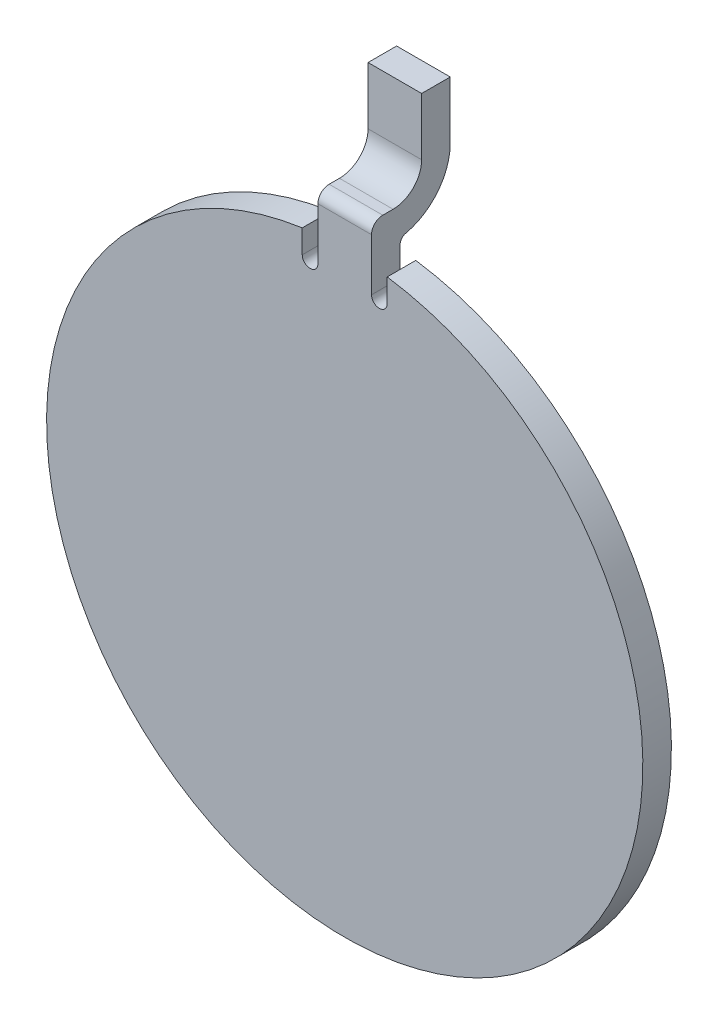
ISO-10303-21;
HEADER;
FILE_DESCRIPTION(('STEP AP214'),'2;1');
FILE_NAME('part.step','',(''),(''),'','','');
FILE_SCHEMA(('AUTOMOTIVE_DESIGN { 1 0 10303 214 1 1 1 1 }'));
ENDSEC;
DATA;
#1=APPLICATION_CONTEXT('core data for automotive mechanical design processes');
#2=APPLICATION_PROTOCOL_DEFINITION('international standard','automotive_design',2000,#1);
#3=PRODUCT_CONTEXT('',#1,'mechanical');
#4=PRODUCT('Part','Part','',(#3));
#5=PRODUCT_RELATED_PRODUCT_CATEGORY('part','',(#4));
#6=PRODUCT_DEFINITION_FORMATION('','',#4);
#7=PRODUCT_DEFINITION_CONTEXT('part definition',#1,'design');
#8=PRODUCT_DEFINITION('design','',#6,#7);
#9=PRODUCT_DEFINITION_SHAPE('','',#8);
#10=(LENGTH_UNIT() NAMED_UNIT(*) SI_UNIT(.MILLI.,.METRE.));
#11=(NAMED_UNIT(*) PLANE_ANGLE_UNIT() SI_UNIT($,.RADIAN.));
#12=(NAMED_UNIT(*) SI_UNIT($,.STERADIAN.) SOLID_ANGLE_UNIT());
#13=UNCERTAINTY_MEASURE_WITH_UNIT(LENGTH_MEASURE(1.E-05),#10,'distance_accuracy_value','');
#14=(GEOMETRIC_REPRESENTATION_CONTEXT(3) GLOBAL_UNCERTAINTY_ASSIGNED_CONTEXT((#13)) GLOBAL_UNIT_ASSIGNED_CONTEXT((#10,
#11,#12)) REPRESENTATION_CONTEXT('',''));
#15=CARTESIAN_POINT('',(0.,0.,0.));
#16=DIRECTION('',(0.,0.,1.));
#17=DIRECTION('',(1.,0.,0.));
#18=AXIS2_PLACEMENT_3D('',#15,#16,#17);
#19=CARTESIAN_POINT('',(-0.476507589397102,37.7055196206584,10.668));
#20=DIRECTION('',(0.,-1.,0.));
#21=DIRECTION('',(0.,0.,-1.));
#22=AXIS2_PLACEMENT_3D('',#19,#20,#21);
#23=PLANE('',#22);
#24=DIRECTION('',(0.,0.,1.));
#25=VECTOR('',#24,1.);
#26=CARTESIAN_POINT('',(-0.476507589397102,37.7055196206584,10.668));
#27=LINE('',#26,#25);
#28=CARTESIAN_POINT('',(-0.476507589397102,37.7055196206584,10.7928766138095));
#29=VERTEX_POINT('',#28);
#30=CARTESIAN_POINT('',(-0.476507589397102,37.7055196206584,10.976));
#31=VERTEX_POINT('',#30);
#32=EDGE_CURVE('E241',#29,#31,#27,.T.);
#33=ORIENTED_EDGE('',*,*,#32,.T.);
#34=DIRECTION('',(1.,0.,0.));
#35=VECTOR('',#34,1.);
#36=CARTESIAN_POINT('',(-0.476507589397102,37.7055196206584,10.976));
#37=LINE('',#36,#35);
#38=CARTESIAN_POINT('',(0.476507589397102,37.7055196206584,10.976));
#39=VERTEX_POINT('',#38);
#40=EDGE_CURVE('E254',#31,#39,#37,.T.);
#41=ORIENTED_EDGE('',*,*,#40,.T.);
#42=DIRECTION('',(0.,0.,1.));
#43=VECTOR('',#42,1.);
#44=CARTESIAN_POINT('',(0.476507589397102,37.7055196206584,10.668));
#45=LINE('',#44,#43);
#46=CARTESIAN_POINT('',(0.476507589397102,37.7055196206584,10.7928766138095));
#47=VERTEX_POINT('',#46);
#48=EDGE_CURVE('E236',#47,#39,#45,.T.);
#49=ORIENTED_EDGE('',*,*,#48,.F.);
#50=DIRECTION('',(-1.,0.,0.));
#51=VECTOR('',#50,1.);
#52=CARTESIAN_POINT('',(0.476507589397102,37.7055196206584,10.7928766138095));
#53=LINE('',#52,#51);
#54=EDGE_CURVE('E222',#47,#29,#53,.T.);
#55=ORIENTED_EDGE('',*,*,#54,.T.);
#56=EDGE_LOOP('',(#33,#41,#49,#55));
#57=FACE_BOUND('',#56,.T.);
#58=ADVANCED_FACE('F39',(#57),#23,.F.);
#59=CARTESIAN_POINT('',(0.,31.75,10.668));
#60=DIRECTION('',(0.,0.,-1.));
#61=DIRECTION('',(-1.,0.,0.));
#62=AXIS2_PLACEMENT_3D('',#59,#60,#61);
#63=PLANE('',#62);
#64=DIRECTION('',(0.,-1.,0.));
#65=VECTOR('',#64,1.);
#66=CARTESIAN_POINT('',(0.476507589397102,37.0276368196465,10.668));
#67=LINE('',#66,#65);
#68=CARTESIAN_POINT('',(0.476507589397102,37.0986173059169,10.668));
#69=VERTEX_POINT('',#68);
#70=CARTESIAN_POINT('',(0.476507589397102,36.5801523813832,10.668));
#71=VERTEX_POINT('',#70);
#72=EDGE_CURVE('E231',#69,#71,#67,.T.);
#73=ORIENTED_EDGE('',*,*,#72,.T.);
#74=CARTESIAN_POINT('',(0.615801998549159,36.5801523813832,10.668));
#75=DIRECTION('',(0.,0.,-1.));
#76=DIRECTION('',(1.,0.,0.));
#77=AXIS2_PLACEMENT_3D('',#74,#75,#76);
#78=CIRCLE('',#77,0.139294409152057);
#79=CARTESIAN_POINT('',(0.755096407701217,36.5801523813832,10.668));
#80=VERTEX_POINT('',#79);
#81=EDGE_CURVE('E162',#80,#71,#78,.T.);
#82=ORIENTED_EDGE('',*,*,#81,.F.);
#83=DIRECTION('',(0.,-1.,0.));
#84=VECTOR('',#83,1.);
#85=CARTESIAN_POINT('',(0.755096407701217,37.0838705948078,10.668));
#86=LINE('',#85,#84);
#87=CARTESIAN_POINT('',(0.755096407701217,36.9950299615844,10.668));
#88=VERTEX_POINT('',#87);
#89=EDGE_CURVE('E170',#88,#80,#86,.T.);
#90=ORIENTED_EDGE('',*,*,#89,.F.);
#91=CARTESIAN_POINT('',(0.,31.75,10.668));
#92=DIRECTION('',(0.,0.,-1.));
#93=DIRECTION('',(-1.,0.,0.));
#94=AXIS2_PLACEMENT_3D('',#91,#92,#93);
#95=CIRCLE('',#94,5.29910463029755);
#96=CARTESIAN_POINT('',(-0.755096407701217,36.9950299615844,10.668));
#97=VERTEX_POINT('',#96);
#98=EDGE_CURVE('E233',#88,#97,#95,.T.);
#99=ORIENTED_EDGE('',*,*,#98,.T.);
#100=DIRECTION('',(0.,1.,0.));
#101=VECTOR('',#100,1.);
#102=CARTESIAN_POINT('',(-0.755096407701217,37.0838705948078,10.668));
#103=LINE('',#102,#101);
#104=CARTESIAN_POINT('',(-0.755096407701217,36.5801523813832,10.668));
#105=VERTEX_POINT('',#104);
#106=EDGE_CURVE('E180',#105,#97,#103,.T.);
#107=ORIENTED_EDGE('',*,*,#106,.F.);
#108=CARTESIAN_POINT('',(-0.615801998549159,36.5801523813832,10.668));
#109=DIRECTION('',(0.,0.,-1.));
#110=DIRECTION('',(-1.,0.,0.));
#111=AXIS2_PLACEMENT_3D('',#108,#109,#110);
#112=CIRCLE('',#111,0.139294409152057);
#113=CARTESIAN_POINT('',(-0.476507589397102,36.5801523813832,10.668));
#114=VERTEX_POINT('',#113);
#115=EDGE_CURVE('E176',#114,#105,#112,.T.);
#116=ORIENTED_EDGE('',*,*,#115,.F.);
#117=DIRECTION('',(0.,1.,0.));
#118=VECTOR('',#117,1.);
#119=CARTESIAN_POINT('',(-0.476507589397102,37.0276368196465,10.668));
#120=LINE('',#119,#118);
#121=CARTESIAN_POINT('',(-0.476507589397102,37.0986173059169,10.668));
#122=VERTEX_POINT('',#121);
#123=EDGE_CURVE('E235',#114,#122,#120,.T.);
#124=ORIENTED_EDGE('',*,*,#123,.T.);
#125=DIRECTION('',(-1.,0.,0.));
#126=VECTOR('',#125,1.);
#127=CARTESIAN_POINT('',(0.,37.0986173059169,10.668));
#128=LINE('',#127,#126);
#129=EDGE_CURVE('E244',#122,#69,#128,.F.);
#130=ORIENTED_EDGE('',*,*,#129,.T.);
#131=EDGE_LOOP('',(#73,#82,#90,#99,#107,#116,#124,#130));
#132=FACE_BOUND('',#131,.T.);
#133=ADVANCED_FACE('F282',(#132),#63,.T.);
#134=CARTESIAN_POINT('',(0.476507589397102,37.0276368196465,10.668));
#135=DIRECTION('',(-1.,0.,0.));
#136=DIRECTION('',(0.,0.,1.));
#137=AXIS2_PLACEMENT_3D('',#134,#135,#136);
#138=PLANE('',#137);
#139=DIRECTION('',(0.,-1.,0.));
#140=VECTOR('',#139,1.);
#141=CARTESIAN_POINT('',(0.476507589397102,37.0276368196465,11.176));
#142=LINE('',#141,#140);
#143=CARTESIAN_POINT('',(0.476507589397102,37.5055196206584,11.176));
#144=VERTEX_POINT('',#143);
#145=CARTESIAN_POINT('',(0.476507589397102,36.5801523813832,11.176));
#146=VERTEX_POINT('',#145);
#147=EDGE_CURVE('E149',#144,#146,#142,.T.);
#148=ORIENTED_EDGE('',*,*,#147,.T.);
#149=DIRECTION('',(0.,0.,-1.));
#150=VECTOR('',#149,1.);
#151=CARTESIAN_POINT('',(0.476507589397102,36.5801523813832,11.176));
#152=LINE('',#151,#150);
#153=EDGE_CURVE('E152',#146,#71,#152,.T.);
#154=ORIENTED_EDGE('',*,*,#153,.T.);
#155=ORIENTED_EDGE('',*,*,#72,.F.);
#156=CARTESIAN_POINT('',(0.476507589397102,37.0986173059169,10.541));
#157=DIRECTION('',(-1.,0.,0.));
#158=DIRECTION('',(0.,0.,1.));
#159=AXIS2_PLACEMENT_3D('',#156,#157,#158);
#160=CIRCLE('',#159,0.127);
#161=CARTESIAN_POINT('',(0.476507589397102,37.2224953408882,10.5689862904233));
#162=VERTEX_POINT('',#161);
#163=EDGE_CURVE('E249',#69,#162,#160,.T.);
#164=ORIENTED_EDGE('',*,*,#163,.T.);
#165=CARTESIAN_POINT('',(0.476507589397102,38.2135196206584,10.7928766138095));
#166=DIRECTION('',(-1.,0.,0.));
#167=DIRECTION('',(0.,0.,1.));
#168=AXIS2_PLACEMENT_3D('',#165,#166,#167);
#169=CIRCLE('',#168,1.016);
#170=CARTESIAN_POINT('',(0.476507589397102,38.2135196206584,9.7768766138095));
#171=VERTEX_POINT('',#170);
#172=EDGE_CURVE('E204',#162,#171,#169,.F.);
#173=ORIENTED_EDGE('',*,*,#172,.T.);
#174=DIRECTION('',(0.,1.,0.));
#175=VECTOR('',#174,1.);
#176=CARTESIAN_POINT('',(0.476507589397102,38.2135196206584,9.7768766138095));
#177=LINE('',#176,#175);
#178=CARTESIAN_POINT('',(0.476507589397102,39.2339446156029,9.7768766138095));
#179=VERTEX_POINT('',#178);
#180=EDGE_CURVE('E202',#171,#179,#177,.T.);
#181=ORIENTED_EDGE('',*,*,#180,.T.);
#182=DIRECTION('',(0.,0.,1.));
#183=VECTOR('',#182,1.);
#184=CARTESIAN_POINT('',(0.476507589397102,39.2339446156029,9.7768766138095));
#185=LINE('',#184,#183);
#186=CARTESIAN_POINT('',(0.476507589397102,39.2339446156029,10.2848766138095));
#187=VERTEX_POINT('',#186);
#188=EDGE_CURVE('E199',#179,#187,#185,.T.);
#189=ORIENTED_EDGE('',*,*,#188,.T.);
#190=DIRECTION('',(0.,1.,0.));
#191=VECTOR('',#190,1.);
#192=CARTESIAN_POINT('',(0.476507589397102,38.2135196206584,10.2848766138095));
#193=LINE('',#192,#191);
#194=CARTESIAN_POINT('',(0.476507589397102,38.2135196206584,10.2848766138095));
#195=VERTEX_POINT('',#194);
#196=EDGE_CURVE('E196',#195,#187,#193,.T.);
#197=ORIENTED_EDGE('',*,*,#196,.F.);
#198=CARTESIAN_POINT('',(0.476507589397102,38.2135196206584,10.7928766138095));
#199=DIRECTION('',(1.,0.,0.));
#200=DIRECTION('',(0.,0.,-1.));
#201=AXIS2_PLACEMENT_3D('',#198,#199,#200);
#202=CIRCLE('',#201,0.508000000000001);
#203=EDGE_CURVE('E206',#47,#195,#202,.T.);
#204=ORIENTED_EDGE('',*,*,#203,.F.);
#205=ORIENTED_EDGE('',*,*,#48,.T.);
#206=CARTESIAN_POINT('',(0.476507589397102,37.5055196206584,10.976));
#207=DIRECTION('',(-1.,0.,0.));
#208=DIRECTION('',(0.,0.,1.));
#209=AXIS2_PLACEMENT_3D('',#206,#207,#208);
#210=CIRCLE('',#209,0.2);
#211=EDGE_CURVE('E155',#39,#144,#210,.F.);
#212=ORIENTED_EDGE('',*,*,#211,.T.);
#213=EDGE_LOOP('',(#148,#154,#155,#164,#173,#181,#189,#197,#204,#205,#212));
#214=FACE_BOUND('',#213,.T.);
#215=ADVANCED_FACE('F150',(#214),#138,.F.);
#216=CARTESIAN_POINT('',(0.,31.75,10.668));
#217=DIRECTION('',(0.,0.,1.));
#218=DIRECTION('',(1.,0.,0.));
#219=AXIS2_PLACEMENT_3D('',#216,#217,#218);
#220=CYLINDRICAL_SURFACE('',#219,5.29910463029755);
#221=ORIENTED_EDGE('',*,*,#98,.F.);
#222=DIRECTION('',(0.,0.,1.));
#223=VECTOR('',#222,1.);
#224=CARTESIAN_POINT('',(0.755096407701217,36.9950299615844,10.668));
#225=LINE('',#224,#223);
#226=CARTESIAN_POINT('',(0.755096407701217,36.9950299615844,11.176));
#227=VERTEX_POINT('',#226);
#228=EDGE_CURVE('E163',#88,#227,#225,.T.);
#229=ORIENTED_EDGE('',*,*,#228,.T.);
#230=CARTESIAN_POINT('',(0.,31.75,11.176));
#231=DIRECTION('',(0.,0.,-1.));
#232=DIRECTION('',(-1.,0.,0.));
#233=AXIS2_PLACEMENT_3D('',#230,#231,#232);
#234=CIRCLE('',#233,5.29910463029755);
#235=CARTESIAN_POINT('',(-0.755096407701217,36.9950299615844,11.176));
#236=VERTEX_POINT('',#235);
#237=EDGE_CURVE('E157',#227,#236,#234,.T.);
#238=ORIENTED_EDGE('',*,*,#237,.T.);
#239=DIRECTION('',(0.,0.,1.));
#240=VECTOR('',#239,1.);
#241=CARTESIAN_POINT('',(-0.755096407701217,36.9950299615844,10.668));
#242=LINE('',#241,#240);
#243=EDGE_CURVE('E190',#236,#97,#242,.F.);
#244=ORIENTED_EDGE('',*,*,#243,.T.);
#245=EDGE_LOOP('',(#221,#229,#238,#244));
#246=FACE_BOUND('',#245,.T.);
#247=ADVANCED_FACE('F293',(#246),#220,.T.);
#248=CARTESIAN_POINT('',(-0.476507589397102,37.0276368196465,10.668));
#249=DIRECTION('',(1.,0.,0.));
#250=DIRECTION('',(0.,0.,-1.));
#251=AXIS2_PLACEMENT_3D('',#248,#249,#250);
#252=PLANE('',#251);
#253=DIRECTION('',(0.,1.,0.));
#254=VECTOR('',#253,1.);
#255=CARTESIAN_POINT('',(-0.476507589397102,37.0276368196465,11.176));
#256=LINE('',#255,#254);
#257=CARTESIAN_POINT('',(-0.476507589397102,36.5801523813832,11.176));
#258=VERTEX_POINT('',#257);
#259=CARTESIAN_POINT('',(-0.476507589397102,37.5055196206584,11.176));
#260=VERTEX_POINT('',#259);
#261=EDGE_CURVE('E62',#258,#260,#256,.T.);
#262=ORIENTED_EDGE('',*,*,#261,.T.);
#263=CARTESIAN_POINT('',(-0.476507589397102,37.5055196206584,10.976));
#264=DIRECTION('',(1.,0.,0.));
#265=DIRECTION('',(0.,0.,-1.));
#266=AXIS2_PLACEMENT_3D('',#263,#264,#265);
#267=CIRCLE('',#266,0.2);
#268=EDGE_CURVE('E47',#260,#31,#267,.F.);
#269=ORIENTED_EDGE('',*,*,#268,.T.);
#270=ORIENTED_EDGE('',*,*,#32,.F.);
#271=CARTESIAN_POINT('',(-0.476507589397102,38.2135196206584,10.7928766138095));
#272=DIRECTION('',(1.,0.,0.));
#273=DIRECTION('',(0.,0.,-1.));
#274=AXIS2_PLACEMENT_3D('',#271,#272,#273);
#275=CIRCLE('',#274,0.508000000000001);
#276=CARTESIAN_POINT('',(-0.476507589397102,38.2135196206584,10.2848766138095));
#277=VERTEX_POINT('',#276);
#278=EDGE_CURVE('E200',#29,#277,#275,.T.);
#279=ORIENTED_EDGE('',*,*,#278,.T.);
#280=DIRECTION('',(0.,1.,0.));
#281=VECTOR('',#280,1.);
#282=CARTESIAN_POINT('',(-0.476507589397102,38.2135196206584,10.2848766138095));
#283=LINE('',#282,#281);
#284=CARTESIAN_POINT('',(-0.476507589397102,39.2339446156029,10.2848766138095));
#285=VERTEX_POINT('',#284);
#286=EDGE_CURVE('E195',#277,#285,#283,.T.);
#287=ORIENTED_EDGE('',*,*,#286,.T.);
#288=DIRECTION('',(0.,0.,1.));
#289=VECTOR('',#288,1.);
#290=CARTESIAN_POINT('',(-0.476507589397102,39.2339446156029,9.7768766138095));
#291=LINE('',#290,#289);
#292=CARTESIAN_POINT('',(-0.476507589397102,39.2339446156029,9.7768766138095));
#293=VERTEX_POINT('',#292);
#294=EDGE_CURVE('E212',#293,#285,#291,.T.);
#295=ORIENTED_EDGE('',*,*,#294,.F.);
#296=DIRECTION('',(0.,1.,0.));
#297=VECTOR('',#296,1.);
#298=CARTESIAN_POINT('',(-0.476507589397102,38.2135196206584,9.7768766138095));
#299=LINE('',#298,#297);
#300=CARTESIAN_POINT('',(-0.476507589397102,38.2135196206584,9.7768766138095));
#301=VERTEX_POINT('',#300);
#302=EDGE_CURVE('E215',#301,#293,#299,.T.);
#303=ORIENTED_EDGE('',*,*,#302,.F.);
#304=CARTESIAN_POINT('',(-0.476507589397102,38.2135196206584,10.7928766138095));
#305=DIRECTION('',(-1.,0.,0.));
#306=DIRECTION('',(0.,0.,1.));
#307=AXIS2_PLACEMENT_3D('',#304,#305,#306);
#308=CIRCLE('',#307,1.016);
#309=CARTESIAN_POINT('',(-0.476507589397102,37.2224953408882,10.5689862904233));
#310=VERTEX_POINT('',#309);
#311=EDGE_CURVE('E217',#310,#301,#308,.F.);
#312=ORIENTED_EDGE('',*,*,#311,.F.);
#313=CARTESIAN_POINT('',(-0.476507589397102,37.0986173059169,10.541));
#314=DIRECTION('',(1.,0.,0.));
#315=DIRECTION('',(0.,0.,-1.));
#316=AXIS2_PLACEMENT_3D('',#313,#314,#315);
#317=CIRCLE('',#316,0.127);
#318=EDGE_CURVE('E251',#310,#122,#317,.T.);
#319=ORIENTED_EDGE('',*,*,#318,.T.);
#320=ORIENTED_EDGE('',*,*,#123,.F.);
#321=DIRECTION('',(0.,0.,-1.));
#322=VECTOR('',#321,1.);
#323=CARTESIAN_POINT('',(-0.476507589397102,36.5801523813832,11.176));
#324=LINE('',#323,#322);
#325=EDGE_CURVE('E183',#258,#114,#324,.T.);
#326=ORIENTED_EDGE('',*,*,#325,.F.);
#327=EDGE_LOOP('',(#262,#269,#270,#279,#287,#295,#303,#312,#319,#320,#326));
#328=FACE_BOUND('',#327,.T.);
#329=ADVANCED_FACE('F262',(#328),#252,.F.);
#330=CARTESIAN_POINT('',(0.,31.75,11.176));
#331=DIRECTION('',(0.,0.,-1.));
#332=DIRECTION('',(-1.,0.,0.));
#333=AXIS2_PLACEMENT_3D('',#330,#331,#332);
#334=PLANE('',#333);
#335=CARTESIAN_POINT('',(0.615801998549159,36.5801523813832,11.176));
#336=DIRECTION('',(0.,0.,-1.));
#337=DIRECTION('',(1.,0.,0.));
#338=AXIS2_PLACEMENT_3D('',#335,#336,#337);
#339=CIRCLE('',#338,0.139294409152057);
#340=CARTESIAN_POINT('',(0.755096407701217,36.5801523813832,11.176));
#341=VERTEX_POINT('',#340);
#342=EDGE_CURVE('E54',#341,#146,#339,.T.);
#343=ORIENTED_EDGE('',*,*,#342,.T.);
#344=ORIENTED_EDGE('',*,*,#147,.F.);
#345=DIRECTION('',(1.,0.,0.));
#346=VECTOR('',#345,1.);
#347=CARTESIAN_POINT('',(0.,37.5055196206584,11.176));
#348=LINE('',#347,#346);
#349=EDGE_CURVE('E258',#144,#260,#348,.F.);
#350=ORIENTED_EDGE('',*,*,#349,.T.);
#351=ORIENTED_EDGE('',*,*,#261,.F.);
#352=CARTESIAN_POINT('',(-0.615801998549159,36.5801523813832,11.176));
#353=DIRECTION('',(0.,0.,-1.));
#354=DIRECTION('',(-1.,0.,0.));
#355=AXIS2_PLACEMENT_3D('',#352,#353,#354);
#356=CIRCLE('',#355,0.139294409152057);
#357=CARTESIAN_POINT('',(-0.755096407701217,36.5801523813832,11.176));
#358=VERTEX_POINT('',#357);
#359=EDGE_CURVE('E177',#258,#358,#356,.T.);
#360=ORIENTED_EDGE('',*,*,#359,.T.);
#361=DIRECTION('',(0.,1.,0.));
#362=VECTOR('',#361,1.);
#363=CARTESIAN_POINT('',(-0.755096407701217,37.0838705948078,11.176));
#364=LINE('',#363,#362);
#365=EDGE_CURVE('E179',#358,#236,#364,.T.);
#366=ORIENTED_EDGE('',*,*,#365,.T.);
#367=ORIENTED_EDGE('',*,*,#237,.F.);
#368=DIRECTION('',(0.,-1.,0.));
#369=VECTOR('',#368,1.);
#370=CARTESIAN_POINT('',(0.755096407701215,31.75,11.176));
#371=LINE('',#370,#369);
#372=EDGE_CURVE('E11',#227,#341,#371,.T.);
#373=ORIENTED_EDGE('',*,*,#372,.T.);
#374=EDGE_LOOP('',(#343,#344,#350,#351,#360,#366,#367,#373));
#375=FACE_BOUND('',#374,.T.);
#376=ADVANCED_FACE('F166',(#375),#334,.F.);
#377=CARTESIAN_POINT('',(0.476507589397102,38.2135196206584,10.2848766138095));
#378=DIRECTION('',(0.,0.,1.));
#379=DIRECTION('',(1.,0.,0.));
#380=AXIS2_PLACEMENT_3D('',#377,#378,#379);
#381=PLANE('',#380);
#382=ORIENTED_EDGE('',*,*,#286,.F.);
#383=DIRECTION('',(-1.,0.,0.));
#384=VECTOR('',#383,1.);
#385=CARTESIAN_POINT('',(0.476507589397102,38.2135196206584,10.2848766138095));
#386=LINE('',#385,#384);
#387=EDGE_CURVE('E158',#195,#277,#386,.T.);
#388=ORIENTED_EDGE('',*,*,#387,.F.);
#389=ORIENTED_EDGE('',*,*,#196,.T.);
#390=DIRECTION('',(-1.,0.,0.));
#391=VECTOR('',#390,1.);
#392=CARTESIAN_POINT('',(0.476507589397102,39.2339446156029,10.2848766138095));
#393=LINE('',#392,#391);
#394=EDGE_CURVE('E209',#187,#285,#393,.T.);
#395=ORIENTED_EDGE('',*,*,#394,.T.);
#396=EDGE_LOOP('',(#382,#388,#389,#395));
#397=FACE_BOUND('',#396,.T.);
#398=ADVANCED_FACE('F316',(#397),#381,.T.);
#399=CARTESIAN_POINT('',(0.476507589397102,38.2135196206584,10.7928766138095));
#400=DIRECTION('',(-1.,0.,0.));
#401=DIRECTION('',(0.,0.,1.));
#402=AXIS2_PLACEMENT_3D('',#399,#400,#401);
#403=CYLINDRICAL_SURFACE('',#402,0.508000000000001);
#404=ORIENTED_EDGE('',*,*,#278,.F.);
#405=ORIENTED_EDGE('',*,*,#54,.F.);
#406=ORIENTED_EDGE('',*,*,#203,.T.);
#407=ORIENTED_EDGE('',*,*,#387,.T.);
#408=EDGE_LOOP('',(#404,#405,#406,#407));
#409=FACE_BOUND('',#408,.T.);
#410=ADVANCED_FACE('F322',(#409),#403,.F.);
#411=CARTESIAN_POINT('',(0.476507589397102,38.2135196206584,10.7928766138095));
#412=DIRECTION('',(-1.,0.,0.));
#413=DIRECTION('',(0.,0.,1.));
#414=AXIS2_PLACEMENT_3D('',#411,#412,#413);
#415=CYLINDRICAL_SURFACE('',#414,1.016);
#416=ORIENTED_EDGE('',*,*,#172,.F.);
#417=DIRECTION('',(-1.,0.,0.));
#418=VECTOR('',#417,1.);
#419=CARTESIAN_POINT('',(0.476507589397102,37.2224953408882,10.5689862904233));
#420=LINE('',#419,#418);
#421=EDGE_CURVE('E247',#162,#310,#420,.T.);
#422=ORIENTED_EDGE('',*,*,#421,.T.);
#423=ORIENTED_EDGE('',*,*,#311,.T.);
#424=DIRECTION('',(-1.,0.,0.));
#425=VECTOR('',#424,1.);
#426=CARTESIAN_POINT('',(0.476507589397102,38.2135196206584,9.7768766138095));
#427=LINE('',#426,#425);
#428=EDGE_CURVE('E224',#171,#301,#427,.T.);
#429=ORIENTED_EDGE('',*,*,#428,.F.);
#430=EDGE_LOOP('',(#416,#422,#423,#429));
#431=FACE_BOUND('',#430,.T.);
#432=ADVANCED_FACE('F330',(#431),#415,.T.);
#433=CARTESIAN_POINT('',(0.476507589397102,38.2135196206584,9.7768766138095));
#434=DIRECTION('',(0.,0.,1.));
#435=DIRECTION('',(1.,0.,0.));
#436=AXIS2_PLACEMENT_3D('',#433,#434,#435);
#437=PLANE('',#436);
#438=ORIENTED_EDGE('',*,*,#302,.T.);
#439=DIRECTION('',(-1.,0.,0.));
#440=VECTOR('',#439,1.);
#441=CARTESIAN_POINT('',(0.476507589397102,39.2339446156029,9.7768766138095));
#442=LINE('',#441,#440);
#443=EDGE_CURVE('E227',#179,#293,#442,.T.);
#444=ORIENTED_EDGE('',*,*,#443,.F.);
#445=ORIENTED_EDGE('',*,*,#180,.F.);
#446=ORIENTED_EDGE('',*,*,#428,.T.);
#447=EDGE_LOOP('',(#438,#444,#445,#446));
#448=FACE_BOUND('',#447,.T.);
#449=ADVANCED_FACE('F338',(#448),#437,.F.);
#450=CARTESIAN_POINT('',(0.476507589397102,39.2339446156029,9.7768766138095));
#451=DIRECTION('',(0.,-1.,0.));
#452=DIRECTION('',(0.,0.,-1.));
#453=AXIS2_PLACEMENT_3D('',#450,#451,#452);
#454=PLANE('',#453);
#455=ORIENTED_EDGE('',*,*,#294,.T.);
#456=ORIENTED_EDGE('',*,*,#394,.F.);
#457=ORIENTED_EDGE('',*,*,#188,.F.);
#458=ORIENTED_EDGE('',*,*,#443,.T.);
#459=EDGE_LOOP('',(#455,#456,#457,#458));
#460=FACE_BOUND('',#459,.T.);
#461=ADVANCED_FACE('F279',(#460),#454,.F.);
#462=CARTESIAN_POINT('',(0.476507589397102,37.0986173059169,10.541));
#463=DIRECTION('',(-1.,0.,0.));
#464=DIRECTION('',(0.,0.,1.));
#465=AXIS2_PLACEMENT_3D('',#462,#463,#464);
#466=CYLINDRICAL_SURFACE('',#465,0.127);
#467=ORIENTED_EDGE('',*,*,#318,.F.);
#468=ORIENTED_EDGE('',*,*,#421,.F.);
#469=ORIENTED_EDGE('',*,*,#163,.F.);
#470=ORIENTED_EDGE('',*,*,#129,.F.);
#471=EDGE_LOOP('',(#467,#468,#469,#470));
#472=FACE_BOUND('',#471,.T.);
#473=ADVANCED_FACE('F271',(#472),#466,.F.);
#474=CARTESIAN_POINT('',(-0.476507589397102,37.5055196206584,10.976));
#475=DIRECTION('',(1.,0.,0.));
#476=DIRECTION('',(0.,0.,-1.));
#477=AXIS2_PLACEMENT_3D('',#474,#475,#476);
#478=CYLINDRICAL_SURFACE('',#477,0.2);
#479=ORIENTED_EDGE('',*,*,#268,.F.);
#480=ORIENTED_EDGE('',*,*,#349,.F.);
#481=ORIENTED_EDGE('',*,*,#211,.F.);
#482=ORIENTED_EDGE('',*,*,#40,.F.);
#483=EDGE_LOOP('',(#479,#480,#481,#482));
#484=FACE_BOUND('',#483,.T.);
#485=ADVANCED_FACE('F41',(#484),#478,.T.);
#486=CARTESIAN_POINT('',(-0.755096407701217,37.0838705948078,11.176));
#487=DIRECTION('',(-1.,0.,0.));
#488=DIRECTION('',(0.,-1.,0.));
#489=AXIS2_PLACEMENT_3D('',#486,#487,#488);
#490=PLANE('',#489);
#491=ORIENTED_EDGE('',*,*,#365,.F.);
#492=DIRECTION('',(0.,0.,-1.));
#493=VECTOR('',#492,1.);
#494=CARTESIAN_POINT('',(-0.755096407701217,36.5801523813832,11.176));
#495=LINE('',#494,#493);
#496=EDGE_CURVE('E188',#358,#105,#495,.T.);
#497=ORIENTED_EDGE('',*,*,#496,.T.);
#498=ORIENTED_EDGE('',*,*,#106,.T.);
#499=ORIENTED_EDGE('',*,*,#243,.F.);
#500=EDGE_LOOP('',(#491,#497,#498,#499));
#501=FACE_BOUND('',#500,.T.);
#502=ADVANCED_FACE('F270',(#501),#490,.F.);
#503=CARTESIAN_POINT('',(-0.615801998549159,36.5801523813832,11.176));
#504=DIRECTION('',(0.,0.,-1.));
#505=DIRECTION('',(-1.,0.,0.));
#506=AXIS2_PLACEMENT_3D('',#503,#504,#505);
#507=CYLINDRICAL_SURFACE('',#506,0.139294409152057);
#508=ORIENTED_EDGE('',*,*,#115,.T.);
#509=ORIENTED_EDGE('',*,*,#496,.F.);
#510=ORIENTED_EDGE('',*,*,#359,.F.);
#511=ORIENTED_EDGE('',*,*,#325,.T.);
#512=EDGE_LOOP('',(#508,#509,#510,#511));
#513=FACE_BOUND('',#512,.T.);
#514=ADVANCED_FACE('F276',(#513),#507,.F.);
#515=CARTESIAN_POINT('',(0.755096407701217,37.0838705948078,11.176));
#516=DIRECTION('',(1.,0.,0.));
#517=DIRECTION('',(0.,1.,0.));
#518=AXIS2_PLACEMENT_3D('',#515,#516,#517);
#519=PLANE('',#518);
#520=ORIENTED_EDGE('',*,*,#89,.T.);
#521=DIRECTION('',(0.,0.,-1.));
#522=VECTOR('',#521,1.);
#523=CARTESIAN_POINT('',(0.755096407701217,36.5801523813832,11.176));
#524=LINE('',#523,#522);
#525=EDGE_CURVE('E164',#341,#80,#524,.T.);
#526=ORIENTED_EDGE('',*,*,#525,.F.);
#527=ORIENTED_EDGE('',*,*,#372,.F.);
#528=ORIENTED_EDGE('',*,*,#228,.F.);
#529=EDGE_LOOP('',(#520,#526,#527,#528));
#530=FACE_BOUND('',#529,.T.);
#531=ADVANCED_FACE('F377',(#530),#519,.F.);
#532=CARTESIAN_POINT('',(0.615801998549159,36.5801523813832,11.176));
#533=DIRECTION('',(0.,0.,-1.));
#534=DIRECTION('',(-1.,0.,0.));
#535=AXIS2_PLACEMENT_3D('',#532,#533,#534);
#536=CYLINDRICAL_SURFACE('',#535,0.139294409152057);
#537=ORIENTED_EDGE('',*,*,#81,.T.);
#538=ORIENTED_EDGE('',*,*,#153,.F.);
#539=ORIENTED_EDGE('',*,*,#342,.F.);
#540=ORIENTED_EDGE('',*,*,#525,.T.);
#541=EDGE_LOOP('',(#537,#538,#539,#540));
#542=FACE_BOUND('',#541,.T.);
#543=ADVANCED_FACE('F160',(#542),#536,.F.);
#544=CLOSED_SHELL('',(#58,#133,#215,#247,#329,#376,#398,#410,#432,#449,#461,#473,#485,#502,#514,
#531,#543));
#545=MANIFOLD_SOLID_BREP('B2',#544);
#546=ADVANCED_BREP_SHAPE_REPRESENTATION('',(#18,#545),#14);
#547=SHAPE_DEFINITION_REPRESENTATION(#9,#546);
ENDSEC;
END-ISO-10303-21;
